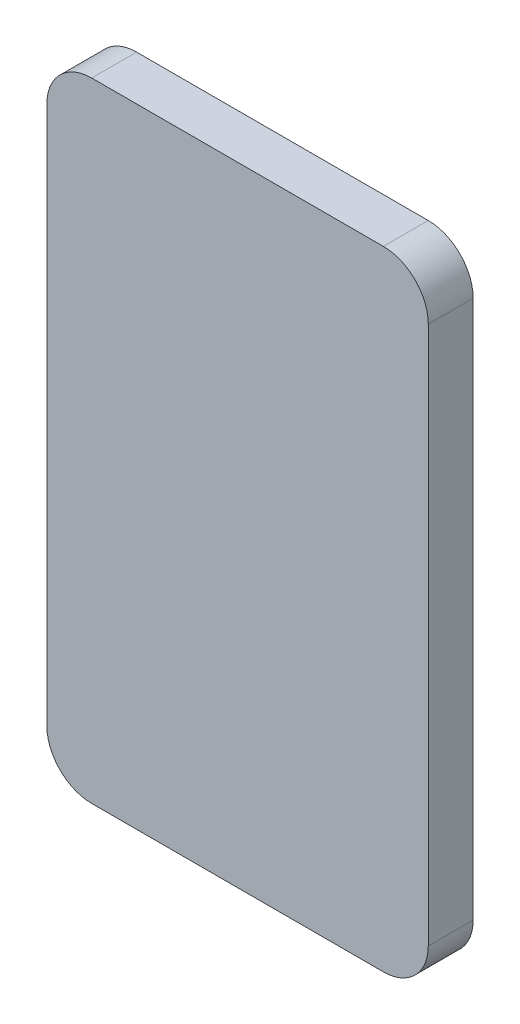
ISO-10303-21;
HEADER;
FILE_DESCRIPTION(('STEP AP214'),'2;1');
FILE_NAME('part.step','',(''),(''),'','','');
FILE_SCHEMA(('AUTOMOTIVE_DESIGN { 1 0 10303 214 1 1 1 1 }'));
ENDSEC;
DATA;
#1=APPLICATION_CONTEXT('core data for automotive mechanical design processes');
#2=APPLICATION_PROTOCOL_DEFINITION('international standard','automotive_design',2000,#1);
#3=PRODUCT_CONTEXT('',#1,'mechanical');
#4=PRODUCT('Part','Part','',(#3));
#5=PRODUCT_RELATED_PRODUCT_CATEGORY('part','',(#4));
#6=PRODUCT_DEFINITION_FORMATION('','',#4);
#7=PRODUCT_DEFINITION_CONTEXT('part definition',#1,'design');
#8=PRODUCT_DEFINITION('design','',#6,#7);
#9=PRODUCT_DEFINITION_SHAPE('','',#8);
#10=(LENGTH_UNIT() NAMED_UNIT(*) SI_UNIT(.MILLI.,.METRE.));
#11=(NAMED_UNIT(*) PLANE_ANGLE_UNIT() SI_UNIT($,.RADIAN.));
#12=(NAMED_UNIT(*) SI_UNIT($,.STERADIAN.) SOLID_ANGLE_UNIT());
#13=UNCERTAINTY_MEASURE_WITH_UNIT(LENGTH_MEASURE(1.E-05),#10,'distance_accuracy_value','');
#14=(GEOMETRIC_REPRESENTATION_CONTEXT(3) GLOBAL_UNCERTAINTY_ASSIGNED_CONTEXT((#13)) GLOBAL_UNIT_ASSIGNED_CONTEXT((#10,
#11,#12)) REPRESENTATION_CONTEXT('',''));
#15=CARTESIAN_POINT('',(0.,0.,0.));
#16=DIRECTION('',(0.,0.,1.));
#17=DIRECTION('',(1.,0.,0.));
#18=AXIS2_PLACEMENT_3D('',#15,#16,#17);
#19=CARTESIAN_POINT('',(0.,0.,2.));
#20=DIRECTION('',(1.,0.,0.));
#21=DIRECTION('',(0.,0.,-1.));
#22=AXIS2_PLACEMENT_3D('',#19,#20,#21);
#23=PLANE('',#22);
#24=DIRECTION('',(0.,-1.,0.));
#25=VECTOR('',#24,1.);
#26=CARTESIAN_POINT('',(0.,0.,0.));
#27=LINE('',#26,#25);
#28=CARTESIAN_POINT('',(0.,26.,0.));
#29=VERTEX_POINT('',#28);
#30=CARTESIAN_POINT('',(0.,2.,0.));
#31=VERTEX_POINT('',#30);
#32=EDGE_CURVE('E128',#29,#31,#27,.T.);
#33=ORIENTED_EDGE('',*,*,#32,.T.);
#34=DIRECTION('',(0.,0.,-1.));
#35=VECTOR('',#34,1.);
#36=CARTESIAN_POINT('',(0.,2.,2.));
#37=LINE('',#36,#35);
#38=CARTESIAN_POINT('',(0.,2.,2.));
#39=VERTEX_POINT('',#38);
#40=EDGE_CURVE('E151',#31,#39,#37,.F.);
#41=ORIENTED_EDGE('',*,*,#40,.T.);
#42=DIRECTION('',(0.,-1.,0.));
#43=VECTOR('',#42,1.);
#44=CARTESIAN_POINT('',(0.,0.,2.));
#45=LINE('',#44,#43);
#46=CARTESIAN_POINT('',(0.,26.,2.));
#47=VERTEX_POINT('',#46);
#48=EDGE_CURVE('E126',#47,#39,#45,.T.);
#49=ORIENTED_EDGE('',*,*,#48,.F.);
#50=DIRECTION('',(0.,0.,-1.));
#51=VECTOR('',#50,1.);
#52=CARTESIAN_POINT('',(0.,26.,2.));
#53=LINE('',#52,#51);
#54=EDGE_CURVE('E148',#47,#29,#53,.T.);
#55=ORIENTED_EDGE('',*,*,#54,.T.);
#56=EDGE_LOOP('',(#33,#41,#49,#55));
#57=FACE_BOUND('',#56,.T.);
#58=ADVANCED_FACE('F33',(#57),#23,.F.);
#59=CARTESIAN_POINT('',(0.,0.,2.));
#60=DIRECTION('',(0.,1.,0.));
#61=DIRECTION('',(0.,0.,1.));
#62=AXIS2_PLACEMENT_3D('',#59,#60,#61);
#63=PLANE('',#62);
#64=DIRECTION('',(1.,0.,0.));
#65=VECTOR('',#64,1.);
#66=CARTESIAN_POINT('',(0.,0.,0.));
#67=LINE('',#66,#65);
#68=CARTESIAN_POINT('',(2.,0.,0.));
#69=VERTEX_POINT('',#68);
#70=CARTESIAN_POINT('',(15.,0.,0.));
#71=VERTEX_POINT('',#70);
#72=EDGE_CURVE('E124',#69,#71,#67,.T.);
#73=ORIENTED_EDGE('',*,*,#72,.T.);
#74=DIRECTION('',(0.,0.,-1.));
#75=VECTOR('',#74,1.);
#76=CARTESIAN_POINT('',(15.,0.,2.));
#77=LINE('',#76,#75);
#78=CARTESIAN_POINT('',(15.,0.,2.));
#79=VERTEX_POINT('',#78);
#80=EDGE_CURVE('E103',#71,#79,#77,.F.);
#81=ORIENTED_EDGE('',*,*,#80,.T.);
#82=DIRECTION('',(1.,0.,0.));
#83=VECTOR('',#82,1.);
#84=CARTESIAN_POINT('',(0.,0.,2.));
#85=LINE('',#84,#83);
#86=CARTESIAN_POINT('',(2.,0.,2.));
#87=VERTEX_POINT('',#86);
#88=EDGE_CURVE('E167',#87,#79,#85,.T.);
#89=ORIENTED_EDGE('',*,*,#88,.F.);
#90=DIRECTION('',(0.,0.,-1.));
#91=VECTOR('',#90,1.);
#92=CARTESIAN_POINT('',(2.,0.,2.));
#93=LINE('',#92,#91);
#94=EDGE_CURVE('E108',#87,#69,#93,.T.);
#95=ORIENTED_EDGE('',*,*,#94,.T.);
#96=EDGE_LOOP('',(#73,#81,#89,#95));
#97=FACE_BOUND('',#96,.T.);
#98=ADVANCED_FACE('F184',(#97),#63,.F.);
#99=CARTESIAN_POINT('',(17.,0.,2.));
#100=DIRECTION('',(-1.,0.,0.));
#101=DIRECTION('',(0.,0.,1.));
#102=AXIS2_PLACEMENT_3D('',#99,#100,#101);
#103=PLANE('',#102);
#104=DIRECTION('',(0.,1.,0.));
#105=VECTOR('',#104,1.);
#106=CARTESIAN_POINT('',(17.,0.,2.));
#107=LINE('',#106,#105);
#108=CARTESIAN_POINT('',(17.,2.,2.));
#109=VERTEX_POINT('',#108);
#110=CARTESIAN_POINT('',(17.,26.,2.));
#111=VERTEX_POINT('',#110);
#112=EDGE_CURVE('E117',#109,#111,#107,.T.);
#113=ORIENTED_EDGE('',*,*,#112,.F.);
#114=DIRECTION('',(0.,0.,-1.));
#115=VECTOR('',#114,1.);
#116=CARTESIAN_POINT('',(17.,2.,2.));
#117=LINE('',#116,#115);
#118=CARTESIAN_POINT('',(17.,2.,0.));
#119=VERTEX_POINT('',#118);
#120=EDGE_CURVE('E102',#109,#119,#117,.T.);
#121=ORIENTED_EDGE('',*,*,#120,.T.);
#122=DIRECTION('',(0.,1.,0.));
#123=VECTOR('',#122,1.);
#124=CARTESIAN_POINT('',(17.,0.,0.));
#125=LINE('',#124,#123);
#126=CARTESIAN_POINT('',(17.,26.,0.));
#127=VERTEX_POINT('',#126);
#128=EDGE_CURVE('E115',#119,#127,#125,.T.);
#129=ORIENTED_EDGE('',*,*,#128,.T.);
#130=DIRECTION('',(0.,0.,-1.));
#131=VECTOR('',#130,1.);
#132=CARTESIAN_POINT('',(17.,26.,2.));
#133=LINE('',#132,#131);
#134=EDGE_CURVE('E119',#127,#111,#133,.F.);
#135=ORIENTED_EDGE('',*,*,#134,.T.);
#136=EDGE_LOOP('',(#113,#121,#129,#135));
#137=FACE_BOUND('',#136,.T.);
#138=ADVANCED_FACE('F114',(#137),#103,.F.);
#139=CARTESIAN_POINT('',(0.,28.,2.));
#140=DIRECTION('',(0.,-1.,0.));
#141=DIRECTION('',(0.,0.,-1.));
#142=AXIS2_PLACEMENT_3D('',#139,#140,#141);
#143=PLANE('',#142);
#144=DIRECTION('',(-1.,0.,0.));
#145=VECTOR('',#144,1.);
#146=CARTESIAN_POINT('',(0.,28.,0.));
#147=LINE('',#146,#145);
#148=CARTESIAN_POINT('',(15.,28.,0.));
#149=VERTEX_POINT('',#148);
#150=CARTESIAN_POINT('',(2.,28.,0.));
#151=VERTEX_POINT('',#150);
#152=EDGE_CURVE('E123',#149,#151,#147,.T.);
#153=ORIENTED_EDGE('',*,*,#152,.T.);
#154=DIRECTION('',(0.,0.,-1.));
#155=VECTOR('',#154,1.);
#156=CARTESIAN_POINT('',(2.,28.,2.));
#157=LINE('',#156,#155);
#158=CARTESIAN_POINT('',(2.,28.,2.));
#159=VERTEX_POINT('',#158);
#160=EDGE_CURVE('E11',#151,#159,#157,.F.);
#161=ORIENTED_EDGE('',*,*,#160,.T.);
#162=DIRECTION('',(-1.,0.,0.));
#163=VECTOR('',#162,1.);
#164=CARTESIAN_POINT('',(0.,28.,2.));
#165=LINE('',#164,#163);
#166=CARTESIAN_POINT('',(15.,28.,2.));
#167=VERTEX_POINT('',#166);
#168=EDGE_CURVE('E132',#167,#159,#165,.T.);
#169=ORIENTED_EDGE('',*,*,#168,.F.);
#170=DIRECTION('',(0.,0.,-1.));
#171=VECTOR('',#170,1.);
#172=CARTESIAN_POINT('',(15.,28.,2.));
#173=LINE('',#172,#171);
#174=EDGE_CURVE('E41',#167,#149,#173,.T.);
#175=ORIENTED_EDGE('',*,*,#174,.T.);
#176=EDGE_LOOP('',(#153,#161,#169,#175));
#177=FACE_BOUND('',#176,.T.);
#178=ADVANCED_FACE('F154',(#177),#143,.F.);
#179=CARTESIAN_POINT('',(0.,0.,2.));
#180=DIRECTION('',(0.,0.,-1.));
#181=DIRECTION('',(-1.,0.,0.));
#182=AXIS2_PLACEMENT_3D('',#179,#180,#181);
#183=PLANE('',#182);
#184=ORIENTED_EDGE('',*,*,#88,.T.);
#185=CARTESIAN_POINT('',(15.,2.,2.));
#186=DIRECTION('',(0.,0.,-1.));
#187=DIRECTION('',(-1.,0.,0.));
#188=AXIS2_PLACEMENT_3D('',#185,#186,#187);
#189=CIRCLE('',#188,2.);
#190=EDGE_CURVE('E146',#79,#109,#189,.F.);
#191=ORIENTED_EDGE('',*,*,#190,.T.);
#192=ORIENTED_EDGE('',*,*,#112,.T.);
#193=CARTESIAN_POINT('',(15.,26.,2.));
#194=DIRECTION('',(0.,0.,-1.));
#195=DIRECTION('',(-1.,0.,0.));
#196=AXIS2_PLACEMENT_3D('',#193,#194,#195);
#197=CIRCLE('',#196,2.);
#198=EDGE_CURVE('E53',#111,#167,#197,.F.);
#199=ORIENTED_EDGE('',*,*,#198,.T.);
#200=ORIENTED_EDGE('',*,*,#168,.T.);
#201=CARTESIAN_POINT('',(2.,26.,2.));
#202=DIRECTION('',(0.,0.,-1.));
#203=DIRECTION('',(-1.,0.,0.));
#204=AXIS2_PLACEMENT_3D('',#201,#202,#203);
#205=CIRCLE('',#204,2.);
#206=EDGE_CURVE('E142',#159,#47,#205,.F.);
#207=ORIENTED_EDGE('',*,*,#206,.T.);
#208=ORIENTED_EDGE('',*,*,#48,.T.);
#209=CARTESIAN_POINT('',(2.,2.,2.));
#210=DIRECTION('',(0.,0.,-1.));
#211=DIRECTION('',(-1.,0.,0.));
#212=AXIS2_PLACEMENT_3D('',#209,#210,#211);
#213=CIRCLE('',#212,2.);
#214=EDGE_CURVE('E144',#39,#87,#213,.F.);
#215=ORIENTED_EDGE('',*,*,#214,.T.);
#216=EDGE_LOOP('',(#184,#191,#192,#199,#200,#207,#208,#215));
#217=FACE_BOUND('',#216,.T.);
#218=ADVANCED_FACE('F173',(#217),#183,.F.);
#219=CARTESIAN_POINT('',(0.,0.,0.));
#220=DIRECTION('',(0.,0.,-1.));
#221=DIRECTION('',(-1.,0.,0.));
#222=AXIS2_PLACEMENT_3D('',#219,#220,#221);
#223=PLANE('',#222);
#224=ORIENTED_EDGE('',*,*,#128,.F.);
#225=CARTESIAN_POINT('',(15.,2.,0.));
#226=DIRECTION('',(0.,0.,-1.));
#227=DIRECTION('',(-1.,0.,0.));
#228=AXIS2_PLACEMENT_3D('',#225,#226,#227);
#229=CIRCLE('',#228,2.);
#230=EDGE_CURVE('E98',#119,#71,#229,.T.);
#231=ORIENTED_EDGE('',*,*,#230,.T.);
#232=ORIENTED_EDGE('',*,*,#72,.F.);
#233=CARTESIAN_POINT('',(2.,2.,0.));
#234=DIRECTION('',(0.,0.,-1.));
#235=DIRECTION('',(-1.,0.,0.));
#236=AXIS2_PLACEMENT_3D('',#233,#234,#235);
#237=CIRCLE('',#236,2.);
#238=EDGE_CURVE('E109',#69,#31,#237,.T.);
#239=ORIENTED_EDGE('',*,*,#238,.T.);
#240=ORIENTED_EDGE('',*,*,#32,.F.);
#241=CARTESIAN_POINT('',(2.,26.,0.));
#242=DIRECTION('',(0.,0.,-1.));
#243=DIRECTION('',(-1.,0.,0.));
#244=AXIS2_PLACEMENT_3D('',#241,#242,#243);
#245=CIRCLE('',#244,2.);
#246=EDGE_CURVE('E135',#29,#151,#245,.T.);
#247=ORIENTED_EDGE('',*,*,#246,.T.);
#248=ORIENTED_EDGE('',*,*,#152,.F.);
#249=CARTESIAN_POINT('',(15.,26.,0.));
#250=DIRECTION('',(0.,0.,-1.));
#251=DIRECTION('',(-1.,0.,0.));
#252=AXIS2_PLACEMENT_3D('',#249,#250,#251);
#253=CIRCLE('',#252,2.);
#254=EDGE_CURVE('E118',#149,#127,#253,.T.);
#255=ORIENTED_EDGE('',*,*,#254,.T.);
#256=EDGE_LOOP('',(#224,#231,#232,#239,#240,#247,#248,#255));
#257=FACE_BOUND('',#256,.T.);
#258=ADVANCED_FACE('F121',(#257),#223,.T.);
#259=CARTESIAN_POINT('',(15.,2.,2.));
#260=DIRECTION('',(0.,0.,-1.));
#261=DIRECTION('',(-1.,0.,0.));
#262=AXIS2_PLACEMENT_3D('',#259,#260,#261);
#263=CYLINDRICAL_SURFACE('',#262,2.);
#264=ORIENTED_EDGE('',*,*,#190,.F.);
#265=ORIENTED_EDGE('',*,*,#80,.F.);
#266=ORIENTED_EDGE('',*,*,#230,.F.);
#267=ORIENTED_EDGE('',*,*,#120,.F.);
#268=EDGE_LOOP('',(#264,#265,#266,#267));
#269=FACE_BOUND('',#268,.T.);
#270=ADVANCED_FACE('F101',(#269),#263,.T.);
#271=CARTESIAN_POINT('',(2.,2.,2.));
#272=DIRECTION('',(0.,0.,-1.));
#273=DIRECTION('',(-1.,0.,0.));
#274=AXIS2_PLACEMENT_3D('',#271,#272,#273);
#275=CYLINDRICAL_SURFACE('',#274,2.);
#276=ORIENTED_EDGE('',*,*,#214,.F.);
#277=ORIENTED_EDGE('',*,*,#40,.F.);
#278=ORIENTED_EDGE('',*,*,#238,.F.);
#279=ORIENTED_EDGE('',*,*,#94,.F.);
#280=EDGE_LOOP('',(#276,#277,#278,#279));
#281=FACE_BOUND('',#280,.T.);
#282=ADVANCED_FACE('F195',(#281),#275,.T.);
#283=CARTESIAN_POINT('',(2.,26.,2.));
#284=DIRECTION('',(0.,0.,-1.));
#285=DIRECTION('',(-1.,0.,0.));
#286=AXIS2_PLACEMENT_3D('',#283,#284,#285);
#287=CYLINDRICAL_SURFACE('',#286,2.);
#288=ORIENTED_EDGE('',*,*,#206,.F.);
#289=ORIENTED_EDGE('',*,*,#160,.F.);
#290=ORIENTED_EDGE('',*,*,#246,.F.);
#291=ORIENTED_EDGE('',*,*,#54,.F.);
#292=EDGE_LOOP('',(#288,#289,#290,#291));
#293=FACE_BOUND('',#292,.T.);
#294=ADVANCED_FACE('F161',(#293),#287,.T.);
#295=CARTESIAN_POINT('',(15.,26.,2.));
#296=DIRECTION('',(0.,0.,-1.));
#297=DIRECTION('',(-1.,0.,0.));
#298=AXIS2_PLACEMENT_3D('',#295,#296,#297);
#299=CYLINDRICAL_SURFACE('',#298,2.);
#300=ORIENTED_EDGE('',*,*,#198,.F.);
#301=ORIENTED_EDGE('',*,*,#134,.F.);
#302=ORIENTED_EDGE('',*,*,#254,.F.);
#303=ORIENTED_EDGE('',*,*,#174,.F.);
#304=EDGE_LOOP('',(#300,#301,#302,#303));
#305=FACE_BOUND('',#304,.T.);
#306=ADVANCED_FACE('F35',(#305),#299,.T.);
#307=CLOSED_SHELL('',(#58,#98,#138,#178,#218,#258,#270,#282,#294,#306));
#308=MANIFOLD_SOLID_BREP('B2',#307);
#309=ADVANCED_BREP_SHAPE_REPRESENTATION('',(#18,#308),#14);
#310=SHAPE_DEFINITION_REPRESENTATION(#9,#309);
ENDSEC;
END-ISO-10303-21;
